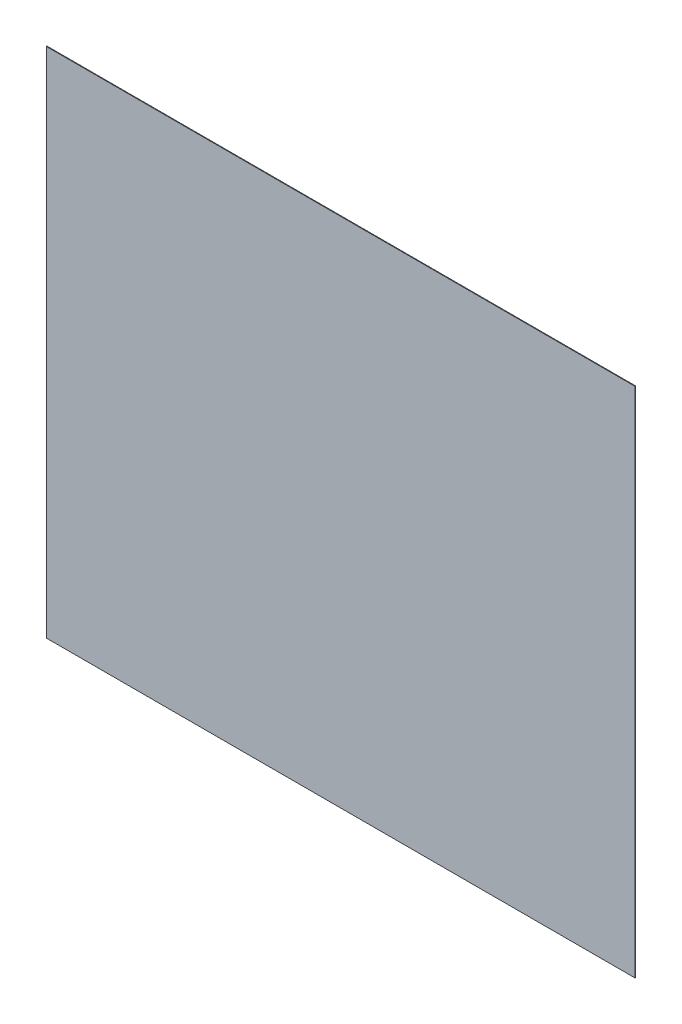
ISO-10303-21;
HEADER;
FILE_DESCRIPTION(('STEP AP214'),'2;1');
FILE_NAME('part.step','',(''),(''),'','','');
FILE_SCHEMA(('AUTOMOTIVE_DESIGN { 1 0 10303 214 1 1 1 1 }'));
ENDSEC;
DATA;
#1=APPLICATION_CONTEXT('core data for automotive mechanical design processes');
#2=APPLICATION_PROTOCOL_DEFINITION('international standard','automotive_design',2000,#1);
#3=PRODUCT_CONTEXT('',#1,'mechanical');
#4=PRODUCT('Part','Part','',(#3));
#5=PRODUCT_RELATED_PRODUCT_CATEGORY('part','',(#4));
#6=PRODUCT_DEFINITION_FORMATION('','',#4);
#7=PRODUCT_DEFINITION_CONTEXT('part definition',#1,'design');
#8=PRODUCT_DEFINITION('design','',#6,#7);
#9=PRODUCT_DEFINITION_SHAPE('','',#8);
#10=(LENGTH_UNIT() NAMED_UNIT(*) SI_UNIT(.MILLI.,.METRE.));
#11=(NAMED_UNIT(*) PLANE_ANGLE_UNIT() SI_UNIT($,.RADIAN.));
#12=(NAMED_UNIT(*) SI_UNIT($,.STERADIAN.) SOLID_ANGLE_UNIT());
#13=UNCERTAINTY_MEASURE_WITH_UNIT(LENGTH_MEASURE(1.E-05),#10,'distance_accuracy_value','');
#14=(GEOMETRIC_REPRESENTATION_CONTEXT(3) GLOBAL_UNCERTAINTY_ASSIGNED_CONTEXT((#13)) GLOBAL_UNIT_ASSIGNED_CONTEXT((#10,
#11,#12)) REPRESENTATION_CONTEXT('',''));
#15=CARTESIAN_POINT('',(0.,0.,0.));
#16=DIRECTION('',(0.,0.,1.));
#17=DIRECTION('',(1.,0.,0.));
#18=AXIS2_PLACEMENT_3D('',#15,#16,#17);
#19=CARTESIAN_POINT('',(-159.152642604525,0.,1.));
#20=DIRECTION('',(1.,0.,0.));
#21=DIRECTION('',(0.,0.,-1.));
#22=AXIS2_PLACEMENT_3D('',#19,#20,#21);
#23=PLANE('',#22);
#24=DIRECTION('',(0.,-1.,0.));
#25=VECTOR('',#24,1.);
#26=CARTESIAN_POINT('',(-159.152642604525,0.,0.));
#27=LINE('',#26,#25);
#28=CARTESIAN_POINT('',(-159.152642604525,791.14,0.));
#29=VERTEX_POINT('',#28);
#30=CARTESIAN_POINT('',(-159.152642604525,0.,0.));
#31=VERTEX_POINT('',#30);
#32=EDGE_CURVE('E97',#29,#31,#27,.T.);
#33=ORIENTED_EDGE('',*,*,#32,.T.);
#34=DIRECTION('',(0.,0.,-1.));
#35=VECTOR('',#34,1.);
#36=CARTESIAN_POINT('',(-159.152642604525,0.,1.));
#37=LINE('',#36,#35);
#38=CARTESIAN_POINT('',(-159.152642604525,0.,1.));
#39=VERTEX_POINT('',#38);
#40=EDGE_CURVE('E11',#39,#31,#37,.T.);
#41=ORIENTED_EDGE('',*,*,#40,.F.);
#42=DIRECTION('',(0.,-1.,0.));
#43=VECTOR('',#42,1.);
#44=CARTESIAN_POINT('',(-159.152642604525,0.,1.));
#45=LINE('',#44,#43);
#46=CARTESIAN_POINT('',(-159.152642604525,791.14,1.));
#47=VERTEX_POINT('',#46);
#48=EDGE_CURVE('E85',#47,#39,#45,.T.);
#49=ORIENTED_EDGE('',*,*,#48,.F.);
#50=DIRECTION('',(0.,0.,-1.));
#51=VECTOR('',#50,1.);
#52=CARTESIAN_POINT('',(-159.152642604525,791.14,1.));
#53=LINE('',#52,#51);
#54=EDGE_CURVE('E93',#47,#29,#53,.T.);
#55=ORIENTED_EDGE('',*,*,#54,.T.);
#56=EDGE_LOOP('',(#33,#41,#49,#55));
#57=FACE_BOUND('',#56,.T.);
#58=ADVANCED_FACE('F34',(#57),#23,.F.);
#59=CARTESIAN_POINT('',(-159.152642604525,0.,1.));
#60=DIRECTION('',(0.,1.,0.));
#61=DIRECTION('',(0.,0.,1.));
#62=AXIS2_PLACEMENT_3D('',#59,#60,#61);
#63=PLANE('',#62);
#64=DIRECTION('',(1.,0.,0.));
#65=VECTOR('',#64,1.);
#66=CARTESIAN_POINT('',(-159.152642604525,0.,0.));
#67=LINE('',#66,#65);
#68=CARTESIAN_POINT('',(750.,0.,0.));
#69=VERTEX_POINT('',#68);
#70=EDGE_CURVE('E89',#31,#69,#67,.T.);
#71=ORIENTED_EDGE('',*,*,#70,.T.);
#72=DIRECTION('',(0.,0.,-1.));
#73=VECTOR('',#72,1.);
#74=CARTESIAN_POINT('',(750.,0.,1.));
#75=LINE('',#74,#73);
#76=CARTESIAN_POINT('',(750.,0.,1.));
#77=VERTEX_POINT('',#76);
#78=EDGE_CURVE('E42',#77,#69,#75,.T.);
#79=ORIENTED_EDGE('',*,*,#78,.F.);
#80=DIRECTION('',(1.,0.,0.));
#81=VECTOR('',#80,1.);
#82=CARTESIAN_POINT('',(-159.152642604525,0.,1.));
#83=LINE('',#82,#81);
#84=EDGE_CURVE('E80',#39,#77,#83,.T.);
#85=ORIENTED_EDGE('',*,*,#84,.F.);
#86=ORIENTED_EDGE('',*,*,#40,.T.);
#87=EDGE_LOOP('',(#71,#79,#85,#86));
#88=FACE_BOUND('',#87,.T.);
#89=ADVANCED_FACE('F88',(#88),#63,.F.);
#90=CARTESIAN_POINT('',(750.,0.,1.));
#91=DIRECTION('',(-1.,0.,0.));
#92=DIRECTION('',(0.,0.,1.));
#93=AXIS2_PLACEMENT_3D('',#90,#91,#92);
#94=PLANE('',#93);
#95=DIRECTION('',(0.,1.,0.));
#96=VECTOR('',#95,1.);
#97=CARTESIAN_POINT('',(750.,0.,0.));
#98=LINE('',#97,#96);
#99=CARTESIAN_POINT('',(750.,791.14,0.));
#100=VERTEX_POINT('',#99);
#101=EDGE_CURVE('E67',#69,#100,#98,.T.);
#102=ORIENTED_EDGE('',*,*,#101,.T.);
#103=DIRECTION('',(0.,0.,-1.));
#104=VECTOR('',#103,1.);
#105=CARTESIAN_POINT('',(750.,791.14,1.));
#106=LINE('',#105,#104);
#107=CARTESIAN_POINT('',(750.,791.14,1.));
#108=VERTEX_POINT('',#107);
#109=EDGE_CURVE('E90',#108,#100,#106,.T.);
#110=ORIENTED_EDGE('',*,*,#109,.F.);
#111=DIRECTION('',(0.,1.,0.));
#112=VECTOR('',#111,1.);
#113=CARTESIAN_POINT('',(750.,0.,1.));
#114=LINE('',#113,#112);
#115=EDGE_CURVE('E83',#77,#108,#114,.T.);
#116=ORIENTED_EDGE('',*,*,#115,.F.);
#117=ORIENTED_EDGE('',*,*,#78,.T.);
#118=EDGE_LOOP('',(#102,#110,#116,#117));
#119=FACE_BOUND('',#118,.T.);
#120=ADVANCED_FACE('F91',(#119),#94,.F.);
#121=CARTESIAN_POINT('',(-159.152642604525,791.14,1.));
#122=DIRECTION('',(0.,-1.,0.));
#123=DIRECTION('',(0.,0.,-1.));
#124=AXIS2_PLACEMENT_3D('',#121,#122,#123);
#125=PLANE('',#124);
#126=DIRECTION('',(-1.,0.,0.));
#127=VECTOR('',#126,1.);
#128=CARTESIAN_POINT('',(-159.152642604525,791.14,0.));
#129=LINE('',#128,#127);
#130=EDGE_CURVE('E73',#100,#29,#129,.T.);
#131=ORIENTED_EDGE('',*,*,#130,.T.);
#132=ORIENTED_EDGE('',*,*,#54,.F.);
#133=DIRECTION('',(-1.,0.,0.));
#134=VECTOR('',#133,1.);
#135=CARTESIAN_POINT('',(-159.152642604525,791.14,1.));
#136=LINE('',#135,#134);
#137=EDGE_CURVE('E50',#108,#47,#136,.T.);
#138=ORIENTED_EDGE('',*,*,#137,.F.);
#139=ORIENTED_EDGE('',*,*,#109,.T.);
#140=EDGE_LOOP('',(#131,#132,#138,#139));
#141=FACE_BOUND('',#140,.T.);
#142=ADVANCED_FACE('F104',(#141),#125,.F.);
#143=CARTESIAN_POINT('',(0.,0.,1.));
#144=DIRECTION('',(0.,0.,-1.));
#145=DIRECTION('',(-1.,0.,0.));
#146=AXIS2_PLACEMENT_3D('',#143,#144,#145);
#147=PLANE('',#146);
#148=ORIENTED_EDGE('',*,*,#48,.T.);
#149=ORIENTED_EDGE('',*,*,#84,.T.);
#150=ORIENTED_EDGE('',*,*,#115,.T.);
#151=ORIENTED_EDGE('',*,*,#137,.T.);
#152=EDGE_LOOP('',(#148,#149,#150,#151));
#153=FACE_BOUND('',#152,.T.);
#154=ADVANCED_FACE('F81',(#153),#147,.F.);
#155=CARTESIAN_POINT('',(0.,0.,0.));
#156=DIRECTION('',(0.,0.,-1.));
#157=DIRECTION('',(-1.,0.,0.));
#158=AXIS2_PLACEMENT_3D('',#155,#156,#157);
#159=PLANE('',#158);
#160=ORIENTED_EDGE('',*,*,#32,.F.);
#161=ORIENTED_EDGE('',*,*,#130,.F.);
#162=ORIENTED_EDGE('',*,*,#101,.F.);
#163=ORIENTED_EDGE('',*,*,#70,.F.);
#164=EDGE_LOOP('',(#160,#161,#162,#163));
#165=FACE_BOUND('',#164,.T.);
#166=ADVANCED_FACE('F107',(#165),#159,.T.);
#167=CLOSED_SHELL('',(#58,#89,#120,#142,#154,#166));
#168=MANIFOLD_SOLID_BREP('B2',#167);
#169=ADVANCED_BREP_SHAPE_REPRESENTATION('',(#18,#168),#14);
#170=SHAPE_DEFINITION_REPRESENTATION(#9,#169);
ENDSEC;
END-ISO-10303-21;
